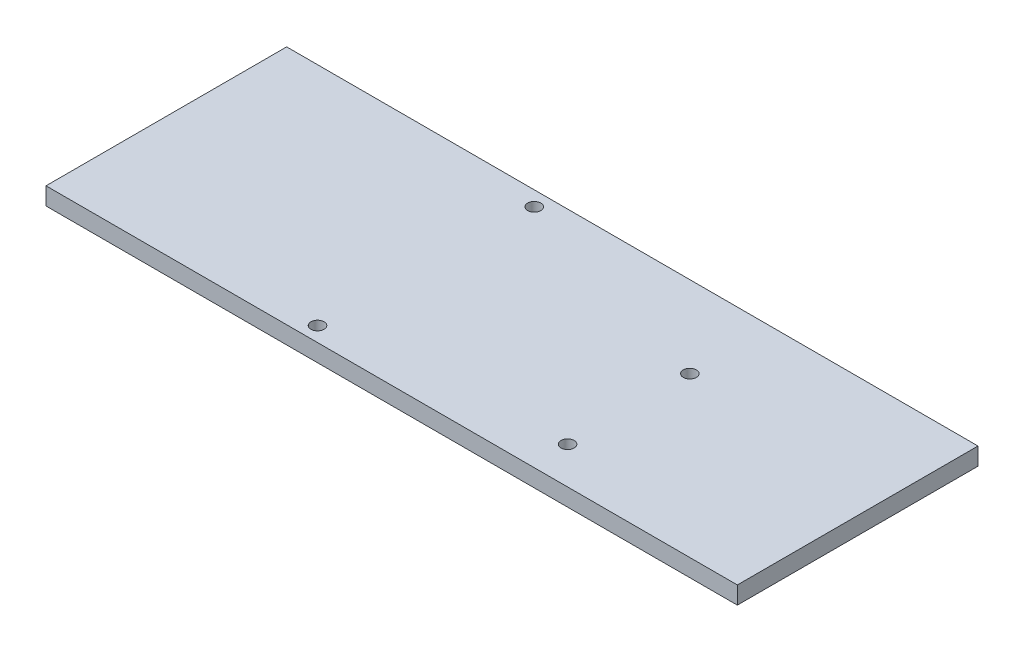
ISO-10303-21;
HEADER;
FILE_DESCRIPTION(('STEP AP214'),'2;1');
FILE_NAME('part.step','',(''),(''),'','','');
FILE_SCHEMA(('AUTOMOTIVE_DESIGN { 1 0 10303 214 1 1 1 1 }'));
ENDSEC;
DATA;
#1=APPLICATION_CONTEXT('core data for automotive mechanical design processes');
#2=APPLICATION_PROTOCOL_DEFINITION('international standard','automotive_design',2000,#1);
#3=PRODUCT_CONTEXT('',#1,'mechanical');
#4=PRODUCT('Part','Part','',(#3));
#5=PRODUCT_RELATED_PRODUCT_CATEGORY('part','',(#4));
#6=PRODUCT_DEFINITION_FORMATION('','',#4);
#7=PRODUCT_DEFINITION_CONTEXT('part definition',#1,'design');
#8=PRODUCT_DEFINITION('design','',#6,#7);
#9=PRODUCT_DEFINITION_SHAPE('','',#8);
#10=(LENGTH_UNIT() NAMED_UNIT(*) SI_UNIT(.MILLI.,.METRE.));
#11=(NAMED_UNIT(*) PLANE_ANGLE_UNIT() SI_UNIT($,.RADIAN.));
#12=(NAMED_UNIT(*) SI_UNIT($,.STERADIAN.) SOLID_ANGLE_UNIT());
#13=UNCERTAINTY_MEASURE_WITH_UNIT(LENGTH_MEASURE(1.E-05),#10,'distance_accuracy_value','');
#14=(GEOMETRIC_REPRESENTATION_CONTEXT(3) GLOBAL_UNCERTAINTY_ASSIGNED_CONTEXT((#13)) GLOBAL_UNIT_ASSIGNED_CONTEXT((#10,
#11,#12)) REPRESENTATION_CONTEXT('',''));
#15=CARTESIAN_POINT('',(0.,0.,0.));
#16=DIRECTION('',(0.,0.,1.));
#17=DIRECTION('',(1.,0.,0.));
#18=AXIS2_PLACEMENT_3D('',#15,#16,#17);
#19=CARTESIAN_POINT('',(0.,4.,0.));
#20=DIRECTION('',(1.,0.,0.));
#21=DIRECTION('',(0.,0.,-1.));
#22=AXIS2_PLACEMENT_3D('',#19,#20,#21);
#23=PLANE('',#22);
#24=DIRECTION('',(0.,0.,1.));
#25=VECTOR('',#24,1.);
#26=CARTESIAN_POINT('',(0.,0.,0.));
#27=LINE('',#26,#25);
#28=CARTESIAN_POINT('',(0.,0.,-55.));
#29=VERTEX_POINT('',#28);
#30=CARTESIAN_POINT('',(0.,0.,0.));
#31=VERTEX_POINT('',#30);
#32=EDGE_CURVE('E104',#29,#31,#27,.T.);
#33=ORIENTED_EDGE('',*,*,#32,.T.);
#34=DIRECTION('',(0.,-1.,0.));
#35=VECTOR('',#34,1.);
#36=CARTESIAN_POINT('',(0.,4.,0.));
#37=LINE('',#36,#35);
#38=CARTESIAN_POINT('',(0.,4.,0.));
#39=VERTEX_POINT('',#38);
#40=EDGE_CURVE('E11',#39,#31,#37,.T.);
#41=ORIENTED_EDGE('',*,*,#40,.F.);
#42=DIRECTION('',(0.,0.,1.));
#43=VECTOR('',#42,1.);
#44=CARTESIAN_POINT('',(0.,4.,0.));
#45=LINE('',#44,#43);
#46=CARTESIAN_POINT('',(0.,4.,-55.));
#47=VERTEX_POINT('',#46);
#48=EDGE_CURVE('E92',#47,#39,#45,.T.);
#49=ORIENTED_EDGE('',*,*,#48,.F.);
#50=DIRECTION('',(0.,-1.,0.));
#51=VECTOR('',#50,1.);
#52=CARTESIAN_POINT('',(0.,4.,-55.));
#53=LINE('',#52,#51);
#54=EDGE_CURVE('E100',#47,#29,#53,.T.);
#55=ORIENTED_EDGE('',*,*,#54,.T.);
#56=EDGE_LOOP('',(#33,#41,#49,#55));
#57=FACE_BOUND('',#56,.T.);
#58=ADVANCED_FACE('F41',(#57),#23,.F.);
#59=CARTESIAN_POINT('',(0.,4.,0.));
#60=DIRECTION('',(0.,0.,-1.));
#61=DIRECTION('',(-1.,0.,0.));
#62=AXIS2_PLACEMENT_3D('',#59,#60,#61);
#63=PLANE('',#62);
#64=DIRECTION('',(1.,0.,0.));
#65=VECTOR('',#64,1.);
#66=CARTESIAN_POINT('',(0.,0.,0.));
#67=LINE('',#66,#65);
#68=CARTESIAN_POINT('',(158.,0.,0.));
#69=VERTEX_POINT('',#68);
#70=EDGE_CURVE('E96',#31,#69,#67,.T.);
#71=ORIENTED_EDGE('',*,*,#70,.T.);
#72=DIRECTION('',(0.,-1.,0.));
#73=VECTOR('',#72,1.);
#74=CARTESIAN_POINT('',(158.,4.,0.));
#75=LINE('',#74,#73);
#76=CARTESIAN_POINT('',(158.,4.,0.));
#77=VERTEX_POINT('',#76);
#78=EDGE_CURVE('E49',#77,#69,#75,.T.);
#79=ORIENTED_EDGE('',*,*,#78,.F.);
#80=DIRECTION('',(1.,0.,0.));
#81=VECTOR('',#80,1.);
#82=CARTESIAN_POINT('',(0.,4.,0.));
#83=LINE('',#82,#81);
#84=EDGE_CURVE('E87',#39,#77,#83,.T.);
#85=ORIENTED_EDGE('',*,*,#84,.F.);
#86=ORIENTED_EDGE('',*,*,#40,.T.);
#87=EDGE_LOOP('',(#71,#79,#85,#86));
#88=FACE_BOUND('',#87,.T.);
#89=ADVANCED_FACE('F95',(#88),#63,.F.);
#90=CARTESIAN_POINT('',(158.,4.,0.));
#91=DIRECTION('',(-1.,0.,0.));
#92=DIRECTION('',(0.,0.,1.));
#93=AXIS2_PLACEMENT_3D('',#90,#91,#92);
#94=PLANE('',#93);
#95=DIRECTION('',(0.,0.,-1.));
#96=VECTOR('',#95,1.);
#97=CARTESIAN_POINT('',(158.,0.,0.));
#98=LINE('',#97,#96);
#99=CARTESIAN_POINT('',(158.,0.,-55.));
#100=VERTEX_POINT('',#99);
#101=EDGE_CURVE('E74',#69,#100,#98,.T.);
#102=ORIENTED_EDGE('',*,*,#101,.T.);
#103=DIRECTION('',(0.,-1.,0.));
#104=VECTOR('',#103,1.);
#105=CARTESIAN_POINT('',(158.,4.,-55.));
#106=LINE('',#105,#104);
#107=CARTESIAN_POINT('',(158.,4.,-55.));
#108=VERTEX_POINT('',#107);
#109=EDGE_CURVE('E97',#108,#100,#106,.T.);
#110=ORIENTED_EDGE('',*,*,#109,.F.);
#111=DIRECTION('',(0.,0.,-1.));
#112=VECTOR('',#111,1.);
#113=CARTESIAN_POINT('',(158.,4.,0.));
#114=LINE('',#113,#112);
#115=EDGE_CURVE('E90',#77,#108,#114,.T.);
#116=ORIENTED_EDGE('',*,*,#115,.F.);
#117=ORIENTED_EDGE('',*,*,#78,.T.);
#118=EDGE_LOOP('',(#102,#110,#116,#117));
#119=FACE_BOUND('',#118,.T.);
#120=ADVANCED_FACE('F98',(#119),#94,.F.);
#121=CARTESIAN_POINT('',(0.,4.,-55.));
#122=DIRECTION('',(0.,0.,1.));
#123=DIRECTION('',(1.,0.,0.));
#124=AXIS2_PLACEMENT_3D('',#121,#122,#123);
#125=PLANE('',#124);
#126=DIRECTION('',(-1.,0.,0.));
#127=VECTOR('',#126,1.);
#128=CARTESIAN_POINT('',(0.,0.,-55.));
#129=LINE('',#128,#127);
#130=EDGE_CURVE('E80',#100,#29,#129,.T.);
#131=ORIENTED_EDGE('',*,*,#130,.T.);
#132=ORIENTED_EDGE('',*,*,#54,.F.);
#133=DIRECTION('',(-1.,0.,0.));
#134=VECTOR('',#133,1.);
#135=CARTESIAN_POINT('',(0.,4.,-55.));
#136=LINE('',#135,#134);
#137=EDGE_CURVE('E57',#108,#47,#136,.T.);
#138=ORIENTED_EDGE('',*,*,#137,.F.);
#139=ORIENTED_EDGE('',*,*,#109,.T.);
#140=EDGE_LOOP('',(#131,#132,#138,#139));
#141=FACE_BOUND('',#140,.T.);
#142=ADVANCED_FACE('F112',(#141),#125,.F.);
#143=CARTESIAN_POINT('',(0.,4.,0.));
#144=DIRECTION('',(0.,-1.,0.));
#145=DIRECTION('',(0.,0.,-1.));
#146=AXIS2_PLACEMENT_3D('',#143,#144,#145);
#147=PLANE('',#146);
#148=CARTESIAN_POINT('',(58.68,4.,-3.37));
#149=DIRECTION('',(0.,1.,0.));
#150=DIRECTION('',(0.,0.,1.));
#151=AXIS2_PLACEMENT_3D('',#148,#149,#150);
#152=CIRCLE('',#151,1.5);
#153=CARTESIAN_POINT('',(58.68,4.,-1.87));
#154=VERTEX_POINT('',#153);
#155=EDGE_CURVE('E124',#154,#154,#152,.T.);
#156=ORIENTED_EDGE('',*,*,#155,.F.);
#157=EDGE_LOOP('',(#156));
#158=FACE_BOUND('',#157,.T.);
#159=CARTESIAN_POINT('',(110.75,4.,-8.45));
#160=DIRECTION('',(0.,1.,0.));
#161=DIRECTION('',(0.,0.,1.));
#162=AXIS2_PLACEMENT_3D('',#159,#160,#161);
#163=CIRCLE('',#162,1.5);
#164=CARTESIAN_POINT('',(110.75,4.,-6.95));
#165=VERTEX_POINT('',#164);
#166=EDGE_CURVE('E130',#165,#165,#163,.T.);
#167=ORIENTED_EDGE('',*,*,#166,.F.);
#168=EDGE_LOOP('',(#167));
#169=FACE_BOUND('',#168,.T.);
#170=CARTESIAN_POINT('',(59.95,4.,-51.63));
#171=DIRECTION('',(0.,1.,0.));
#172=DIRECTION('',(0.,0.,1.));
#173=AXIS2_PLACEMENT_3D('',#170,#171,#172);
#174=CIRCLE('',#173,1.5);
#175=CARTESIAN_POINT('',(59.95,4.,-50.13));
#176=VERTEX_POINT('',#175);
#177=EDGE_CURVE('E136',#176,#176,#174,.T.);
#178=ORIENTED_EDGE('',*,*,#177,.F.);
#179=EDGE_LOOP('',(#178));
#180=FACE_BOUND('',#179,.T.);
#181=CARTESIAN_POINT('',(110.75,4.,-36.39));
#182=DIRECTION('',(0.,1.,0.));
#183=DIRECTION('',(0.,0.,1.));
#184=AXIS2_PLACEMENT_3D('',#181,#182,#183);
#185=CIRCLE('',#184,1.5);
#186=CARTESIAN_POINT('',(110.75,4.,-34.89));
#187=VERTEX_POINT('',#186);
#188=EDGE_CURVE('E107',#187,#187,#185,.T.);
#189=ORIENTED_EDGE('',*,*,#188,.F.);
#190=EDGE_LOOP('',(#189));
#191=FACE_BOUND('',#190,.T.);
#192=ORIENTED_EDGE('',*,*,#48,.T.);
#193=ORIENTED_EDGE('',*,*,#84,.T.);
#194=ORIENTED_EDGE('',*,*,#115,.T.);
#195=ORIENTED_EDGE('',*,*,#137,.T.);
#196=EDGE_LOOP('',(#192,#193,#194,#195));
#197=FACE_BOUND('',#196,.T.);
#198=ADVANCED_FACE('F88',(#158,#169,#180,#191,#197),#147,.F.);
#199=CARTESIAN_POINT('',(0.,0.,0.));
#200=DIRECTION('',(0.,-1.,0.));
#201=DIRECTION('',(0.,0.,-1.));
#202=AXIS2_PLACEMENT_3D('',#199,#200,#201);
#203=PLANE('',#202);
#204=CARTESIAN_POINT('',(58.68,0.,-3.37));
#205=DIRECTION('',(0.,-1.,0.));
#206=DIRECTION('',(0.,0.,-1.));
#207=AXIS2_PLACEMENT_3D('',#204,#205,#206);
#208=CIRCLE('',#207,1.5);
#209=CARTESIAN_POINT('',(58.68,0.,-4.87000000000001));
#210=VERTEX_POINT('',#209);
#211=EDGE_CURVE('E127',#210,#210,#208,.F.);
#212=ORIENTED_EDGE('',*,*,#211,.T.);
#213=EDGE_LOOP('',(#212));
#214=FACE_BOUND('',#213,.T.);
#215=CARTESIAN_POINT('',(110.75,0.,-8.45));
#216=DIRECTION('',(0.,-1.,0.));
#217=DIRECTION('',(0.,0.,-1.));
#218=AXIS2_PLACEMENT_3D('',#215,#216,#217);
#219=CIRCLE('',#218,1.5);
#220=CARTESIAN_POINT('',(110.75,0.,-9.95));
#221=VERTEX_POINT('',#220);
#222=EDGE_CURVE('E133',#221,#221,#219,.F.);
#223=ORIENTED_EDGE('',*,*,#222,.T.);
#224=EDGE_LOOP('',(#223));
#225=FACE_BOUND('',#224,.T.);
#226=CARTESIAN_POINT('',(59.95,0.,-51.63));
#227=DIRECTION('',(0.,-1.,0.));
#228=DIRECTION('',(0.,0.,-1.));
#229=AXIS2_PLACEMENT_3D('',#226,#227,#228);
#230=CIRCLE('',#229,1.5);
#231=CARTESIAN_POINT('',(59.95,0.,-53.13));
#232=VERTEX_POINT('',#231);
#233=EDGE_CURVE('E121',#232,#232,#230,.F.);
#234=ORIENTED_EDGE('',*,*,#233,.T.);
#235=EDGE_LOOP('',(#234));
#236=FACE_BOUND('',#235,.T.);
#237=CARTESIAN_POINT('',(110.75,0.,-36.39));
#238=DIRECTION('',(0.,-1.,0.));
#239=DIRECTION('',(0.,0.,-1.));
#240=AXIS2_PLACEMENT_3D('',#237,#238,#239);
#241=CIRCLE('',#240,1.5);
#242=CARTESIAN_POINT('',(110.75,0.,-37.89));
#243=VERTEX_POINT('',#242);
#244=EDGE_CURVE('E118',#243,#243,#241,.F.);
#245=ORIENTED_EDGE('',*,*,#244,.T.);
#246=EDGE_LOOP('',(#245));
#247=FACE_BOUND('',#246,.T.);
#248=ORIENTED_EDGE('',*,*,#32,.F.);
#249=ORIENTED_EDGE('',*,*,#130,.F.);
#250=ORIENTED_EDGE('',*,*,#101,.F.);
#251=ORIENTED_EDGE('',*,*,#70,.F.);
#252=EDGE_LOOP('',(#248,#249,#250,#251));
#253=FACE_BOUND('',#252,.T.);
#254=ADVANCED_FACE('F115',(#214,#225,#236,#247,#253),#203,.T.);
#255=CARTESIAN_POINT('',(110.75,-0.00100000000000013,-36.39));
#256=DIRECTION('',(0.,1.,0.));
#257=DIRECTION('',(0.,0.,1.));
#258=AXIS2_PLACEMENT_3D('',#255,#256,#257);
#259=CYLINDRICAL_SURFACE('',#258,1.5);
#260=ORIENTED_EDGE('',*,*,#244,.F.);
#261=EDGE_LOOP('',(#260));
#262=FACE_BOUND('',#261,.T.);
#263=ORIENTED_EDGE('',*,*,#188,.T.);
#264=EDGE_LOOP('',(#263));
#265=FACE_BOUND('',#264,.T.);
#266=ADVANCED_FACE('F148',(#262,#265),#259,.F.);
#267=CARTESIAN_POINT('',(59.95,-0.00100000000000013,-51.63));
#268=DIRECTION('',(0.,1.,0.));
#269=DIRECTION('',(0.,0.,1.));
#270=AXIS2_PLACEMENT_3D('',#267,#268,#269);
#271=CYLINDRICAL_SURFACE('',#270,1.5);
#272=ORIENTED_EDGE('',*,*,#233,.F.);
#273=EDGE_LOOP('',(#272));
#274=FACE_BOUND('',#273,.T.);
#275=ORIENTED_EDGE('',*,*,#177,.T.);
#276=EDGE_LOOP('',(#275));
#277=FACE_BOUND('',#276,.T.);
#278=ADVANCED_FACE('F144',(#274,#277),#271,.F.);
#279=CARTESIAN_POINT('',(110.75,-0.00100000000000013,-8.45));
#280=DIRECTION('',(0.,1.,0.));
#281=DIRECTION('',(0.,0.,1.));
#282=AXIS2_PLACEMENT_3D('',#279,#280,#281);
#283=CYLINDRICAL_SURFACE('',#282,1.5);
#284=ORIENTED_EDGE('',*,*,#222,.F.);
#285=EDGE_LOOP('',(#284));
#286=FACE_BOUND('',#285,.T.);
#287=ORIENTED_EDGE('',*,*,#166,.T.);
#288=EDGE_LOOP('',(#287));
#289=FACE_BOUND('',#288,.T.);
#290=ADVANCED_FACE('F147',(#286,#289),#283,.F.);
#291=CARTESIAN_POINT('',(58.68,-0.00100000000000013,-3.37));
#292=DIRECTION('',(0.,1.,0.));
#293=DIRECTION('',(0.,0.,1.));
#294=AXIS2_PLACEMENT_3D('',#291,#292,#293);
#295=CYLINDRICAL_SURFACE('',#294,1.5);
#296=ORIENTED_EDGE('',*,*,#211,.F.);
#297=EDGE_LOOP('',(#296));
#298=FACE_BOUND('',#297,.T.);
#299=ORIENTED_EDGE('',*,*,#155,.T.);
#300=EDGE_LOOP('',(#299));
#301=FACE_BOUND('',#300,.T.);
#302=ADVANCED_FACE('F211',(#298,#301),#295,.F.);
#303=CLOSED_SHELL('',(#58,#89,#120,#142,#198,#254,#266,#278,#290,#302));
#304=MANIFOLD_SOLID_BREP('B2',#303);
#305=ADVANCED_BREP_SHAPE_REPRESENTATION('',(#18,#304),#14);
#306=SHAPE_DEFINITION_REPRESENTATION(#9,#305);
ENDSEC;
END-ISO-10303-21;
